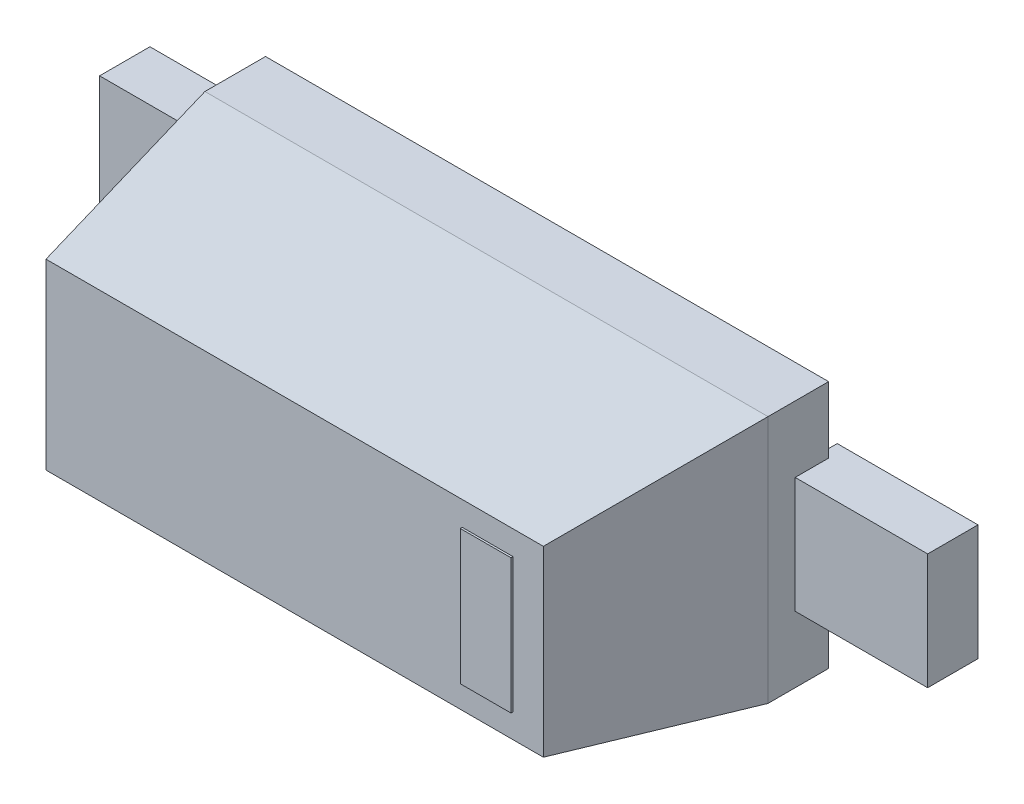
ISO-10303-21;
HEADER;
FILE_DESCRIPTION(('STEP AP214'),'2;1');
FILE_NAME('part.step','',(''),(''),'','','');
FILE_SCHEMA(('AUTOMOTIVE_DESIGN { 1 0 10303 214 1 1 1 1 }'));
ENDSEC;
DATA;
#1=APPLICATION_CONTEXT('core data for automotive mechanical design processes');
#2=APPLICATION_PROTOCOL_DEFINITION('international standard','automotive_design',2000,#1);
#3=PRODUCT_CONTEXT('',#1,'mechanical');
#4=PRODUCT('Part','Part','',(#3));
#5=PRODUCT_RELATED_PRODUCT_CATEGORY('part','',(#4));
#6=PRODUCT_DEFINITION_FORMATION('','',#4);
#7=PRODUCT_DEFINITION_CONTEXT('part definition',#1,'design');
#8=PRODUCT_DEFINITION('design','',#6,#7);
#9=PRODUCT_DEFINITION_SHAPE('','',#8);
#10=(LENGTH_UNIT() NAMED_UNIT(*) SI_UNIT(.MILLI.,.METRE.));
#11=(NAMED_UNIT(*) PLANE_ANGLE_UNIT() SI_UNIT($,.RADIAN.));
#12=(NAMED_UNIT(*) SI_UNIT($,.STERADIAN.) SOLID_ANGLE_UNIT());
#13=UNCERTAINTY_MEASURE_WITH_UNIT(LENGTH_MEASURE(1.E-05),#10,'distance_accuracy_value','');
#14=(GEOMETRIC_REPRESENTATION_CONTEXT(3) GLOBAL_UNCERTAINTY_ASSIGNED_CONTEXT((#13)) GLOBAL_UNIT_ASSIGNED_CONTEXT((#10,
#11,#12)) REPRESENTATION_CONTEXT('',''));
#15=CARTESIAN_POINT('',(0.,0.,0.));
#16=DIRECTION('',(0.,0.,1.));
#17=DIRECTION('',(1.,0.,0.));
#18=AXIS2_PLACEMENT_3D('',#15,#16,#17);
#19=CARTESIAN_POINT('',(0.506,-0.203,0.819));
#20=DIRECTION('',(0.,0.,1.));
#21=DIRECTION('',(1.,0.,0.));
#22=AXIS2_PLACEMENT_3D('',#19,#20,#21);
#23=PLANE('',#22);
#24=DIRECTION('',(1.,0.,0.));
#25=VECTOR('',#24,1.);
#26=CARTESIAN_POINT('',(0.506,-0.203,0.819));
#27=LINE('',#26,#25);
#28=CARTESIAN_POINT('',(0.506,-0.203,0.819));
#29=VERTEX_POINT('',#28);
#30=CARTESIAN_POINT('',(0.659,-0.203,0.819));
#31=VERTEX_POINT('',#30);
#32=EDGE_CURVE('P0_E86',#29,#31,#27,.T.);
#33=ORIENTED_EDGE('',*,*,#32,.T.);
#34=DIRECTION('',(0.,1.,0.));
#35=VECTOR('',#34,1.);
#36=CARTESIAN_POINT('',(0.659,-0.203,0.819));
#37=LINE('',#36,#35);
#38=CARTESIAN_POINT('',(0.659,0.203,0.819));
#39=VERTEX_POINT('',#38);
#40=EDGE_CURVE('P0_E84',#31,#39,#37,.T.);
#41=ORIENTED_EDGE('',*,*,#40,.T.);
#42=DIRECTION('',(-1.,0.,0.));
#43=VECTOR('',#42,1.);
#44=CARTESIAN_POINT('',(0.659,0.203,0.819));
#45=LINE('',#44,#43);
#46=CARTESIAN_POINT('',(0.506,0.203,0.819));
#47=VERTEX_POINT('',#46);
#48=EDGE_CURVE('P0_E75',#39,#47,#45,.T.);
#49=ORIENTED_EDGE('',*,*,#48,.T.);
#50=DIRECTION('',(0.,-1.,0.));
#51=VECTOR('',#50,1.);
#52=CARTESIAN_POINT('',(0.506,0.203,0.819));
#53=LINE('',#52,#51);
#54=EDGE_CURVE('P0_E11',#47,#29,#53,.T.);
#55=ORIENTED_EDGE('',*,*,#54,.T.);
#56=EDGE_LOOP('',(#33,#41,#49,#55));
#57=FACE_BOUND('',#56,.T.);
#58=ADVANCED_FACE('P0_F17',(#57),#23,.T.);
#59=CARTESIAN_POINT('',(0.506,0.203,0.813));
#60=DIRECTION('',(0.,0.,-1.));
#61=DIRECTION('',(0.,-1.,0.));
#62=AXIS2_PLACEMENT_3D('',#59,#60,#61);
#63=PLANE('',#62);
#64=DIRECTION('',(1.,0.,0.));
#65=VECTOR('',#64,1.);
#66=CARTESIAN_POINT('',(0.506,0.203,0.813));
#67=LINE('',#66,#65);
#68=CARTESIAN_POINT('',(0.506,0.203,0.813));
#69=VERTEX_POINT('',#68);
#70=CARTESIAN_POINT('',(0.659,0.203,0.813));
#71=VERTEX_POINT('',#70);
#72=EDGE_CURVE('P0_E69',#69,#71,#67,.T.);
#73=ORIENTED_EDGE('',*,*,#72,.T.);
#74=DIRECTION('',(0.,-1.,0.));
#75=VECTOR('',#74,1.);
#76=CARTESIAN_POINT('',(0.659,0.203,0.813));
#77=LINE('',#76,#75);
#78=CARTESIAN_POINT('',(0.659,-0.203,0.813));
#79=VERTEX_POINT('',#78);
#80=EDGE_CURVE('P0_E21',#71,#79,#77,.T.);
#81=ORIENTED_EDGE('',*,*,#80,.T.);
#82=DIRECTION('',(-1.,0.,0.));
#83=VECTOR('',#82,1.);
#84=CARTESIAN_POINT('',(0.659,-0.203,0.813));
#85=LINE('',#84,#83);
#86=CARTESIAN_POINT('',(0.506,-0.203,0.813));
#87=VERTEX_POINT('',#86);
#88=EDGE_CURVE('P0_E110',#79,#87,#85,.T.);
#89=ORIENTED_EDGE('',*,*,#88,.T.);
#90=DIRECTION('',(0.,1.,0.));
#91=VECTOR('',#90,1.);
#92=CARTESIAN_POINT('',(0.506,-0.203,0.813));
#93=LINE('',#92,#91);
#94=EDGE_CURVE('P0_E28',#87,#69,#93,.T.);
#95=ORIENTED_EDGE('',*,*,#94,.T.);
#96=EDGE_LOOP('',(#73,#81,#89,#95));
#97=FACE_BOUND('',#96,.T.);
#98=ADVANCED_FACE('P0_F122',(#97),#63,.T.);
#99=CARTESIAN_POINT('',(0.506,0.203,0.813));
#100=DIRECTION('',(-1.,0.,0.));
#101=DIRECTION('',(0.,0.,1.));
#102=AXIS2_PLACEMENT_3D('',#99,#100,#101);
#103=PLANE('',#102);
#104=ORIENTED_EDGE('',*,*,#94,.F.);
#105=DIRECTION('',(0.,0.,1.));
#106=VECTOR('',#105,1.);
#107=CARTESIAN_POINT('',(0.506,-0.203,0.813));
#108=LINE('',#107,#106);
#109=EDGE_CURVE('P0_E99',#87,#29,#108,.T.);
#110=ORIENTED_EDGE('',*,*,#109,.T.);
#111=ORIENTED_EDGE('',*,*,#54,.F.);
#112=DIRECTION('',(0.,0.,-1.));
#113=VECTOR('',#112,1.);
#114=CARTESIAN_POINT('',(0.506,0.203,0.819));
#115=LINE('',#114,#113);
#116=EDGE_CURVE('P0_E81',#47,#69,#115,.T.);
#117=ORIENTED_EDGE('',*,*,#116,.T.);
#118=EDGE_LOOP('',(#104,#110,#111,#117));
#119=FACE_BOUND('',#118,.T.);
#120=ADVANCED_FACE('P0_F19',(#119),#103,.T.);
#121=CARTESIAN_POINT('',(0.659,0.203,0.813));
#122=DIRECTION('',(0.,1.,0.));
#123=DIRECTION('',(1.,0.,0.));
#124=AXIS2_PLACEMENT_3D('',#121,#122,#123);
#125=PLANE('',#124);
#126=ORIENTED_EDGE('',*,*,#72,.F.);
#127=ORIENTED_EDGE('',*,*,#116,.F.);
#128=ORIENTED_EDGE('',*,*,#48,.F.);
#129=DIRECTION('',(0.,0.,-1.));
#130=VECTOR('',#129,1.);
#131=CARTESIAN_POINT('',(0.659,0.203,0.819));
#132=LINE('',#131,#130);
#133=EDGE_CURVE('P0_E79',#39,#71,#132,.T.);
#134=ORIENTED_EDGE('',*,*,#133,.T.);
#135=EDGE_LOOP('',(#126,#127,#128,#134));
#136=FACE_BOUND('',#135,.T.);
#137=ADVANCED_FACE('P0_F77',(#136),#125,.T.);
#138=CARTESIAN_POINT('',(0.659,-0.203,0.813));
#139=DIRECTION('',(1.,0.,0.));
#140=DIRECTION('',(0.,1.,0.));
#141=AXIS2_PLACEMENT_3D('',#138,#139,#140);
#142=PLANE('',#141);
#143=ORIENTED_EDGE('',*,*,#80,.F.);
#144=ORIENTED_EDGE('',*,*,#133,.F.);
#145=ORIENTED_EDGE('',*,*,#40,.F.);
#146=DIRECTION('',(0.,0.,-1.));
#147=VECTOR('',#146,1.);
#148=CARTESIAN_POINT('',(0.659,-0.203,0.819));
#149=LINE('',#148,#147);
#150=EDGE_CURVE('P0_E106',#31,#79,#149,.T.);
#151=ORIENTED_EDGE('',*,*,#150,.T.);
#152=EDGE_LOOP('',(#143,#144,#145,#151));
#153=FACE_BOUND('',#152,.T.);
#154=ADVANCED_FACE('P0_F92',(#153),#142,.T.);
#155=CARTESIAN_POINT('',(0.506,-0.203,0.813));
#156=DIRECTION('',(0.,-1.,0.));
#157=DIRECTION('',(0.,0.,-1.));
#158=AXIS2_PLACEMENT_3D('',#155,#156,#157);
#159=PLANE('',#158);
#160=ORIENTED_EDGE('',*,*,#88,.F.);
#161=ORIENTED_EDGE('',*,*,#150,.F.);
#162=ORIENTED_EDGE('',*,*,#32,.F.);
#163=ORIENTED_EDGE('',*,*,#109,.F.);
#164=EDGE_LOOP('',(#160,#161,#162,#163));
#165=FACE_BOUND('',#164,.T.);
#166=ADVANCED_FACE('P0_F121',(#165),#159,.T.);
#167=CLOSED_SHELL('',(#58,#98,#120,#137,#154,#166));
#168=MANIFOLD_SOLID_BREP('P0_B1',#167);
#169=CARTESIAN_POINT('',(-0.85,0.375,0.051));
#170=DIRECTION('',(-1.,0.,0.));
#171=DIRECTION('',(0.,0.,1.));
#172=AXIS2_PLACEMENT_3D('',#169,#170,#171);
#173=PLANE('',#172);
#174=DIRECTION('',(0.,-1.,0.));
#175=VECTOR('',#174,1.);
#176=CARTESIAN_POINT('',(-0.85,0.375,0.051));
#177=LINE('',#176,#175);
#178=CARTESIAN_POINT('',(-0.85,0.375,0.051));
#179=VERTEX_POINT('',#178);
#180=CARTESIAN_POINT('',(-0.85,-0.375,0.051));
#181=VERTEX_POINT('',#180);
#182=EDGE_CURVE('P1_E117',#179,#181,#177,.T.);
#183=ORIENTED_EDGE('',*,*,#182,.T.);
#184=DIRECTION('',(0.,0.,1.));
#185=VECTOR('',#184,1.);
#186=CARTESIAN_POINT('',(-0.85,-0.375,0.051));
#187=LINE('',#186,#185);
#188=CARTESIAN_POINT('',(-0.85,-0.375,0.234));
#189=VERTEX_POINT('',#188);
#190=EDGE_CURVE('P1_E91',#181,#189,#187,.T.);
#191=ORIENTED_EDGE('',*,*,#190,.T.);
#192=DIRECTION('',(0.,1.,0.));
#193=VECTOR('',#192,1.);
#194=CARTESIAN_POINT('',(-0.85,-0.375,0.234));
#195=LINE('',#194,#193);
#196=CARTESIAN_POINT('',(-0.85,0.375,0.234));
#197=VERTEX_POINT('',#196);
#198=EDGE_CURVE('P1_E92',#189,#197,#195,.T.);
#199=ORIENTED_EDGE('',*,*,#198,.T.);
#200=DIRECTION('',(0.,0.,-1.));
#201=VECTOR('',#200,1.);
#202=CARTESIAN_POINT('',(-0.85,0.375,0.234));
#203=LINE('',#202,#201);
#204=EDGE_CURVE('P1_E11',#197,#179,#203,.T.);
#205=ORIENTED_EDGE('',*,*,#204,.T.);
#206=EDGE_LOOP('',(#183,#191,#199,#205));
#207=FACE_BOUND('',#206,.T.);
#208=ADVANCED_FACE('P1_F17',(#207),#173,.T.);
#209=CARTESIAN_POINT('',(0.85,0.375,0.051));
#210=DIRECTION('',(0.,1.,0.));
#211=DIRECTION('',(1.,0.,0.));
#212=AXIS2_PLACEMENT_3D('',#209,#210,#211);
#213=PLANE('',#212);
#214=DIRECTION('',(-1.,0.,0.));
#215=VECTOR('',#214,1.);
#216=CARTESIAN_POINT('',(0.85,0.375,0.051));
#217=LINE('',#216,#215);
#218=CARTESIAN_POINT('',(0.85,0.375,0.051));
#219=VERTEX_POINT('',#218);
#220=EDGE_CURVE('P1_E158',#219,#179,#217,.T.);
#221=ORIENTED_EDGE('',*,*,#220,.T.);
#222=ORIENTED_EDGE('',*,*,#204,.F.);
#223=DIRECTION('',(1.,0.,0.));
#224=VECTOR('',#223,1.);
#225=CARTESIAN_POINT('',(-0.85,0.375,0.234));
#226=LINE('',#225,#224);
#227=CARTESIAN_POINT('',(0.85,0.375,0.234));
#228=VERTEX_POINT('',#227);
#229=EDGE_CURVE('P1_E129',#197,#228,#226,.T.);
#230=ORIENTED_EDGE('',*,*,#229,.T.);
#231=DIRECTION('',(0.,0.,-1.));
#232=VECTOR('',#231,1.);
#233=CARTESIAN_POINT('',(0.85,0.375,0.234));
#234=LINE('',#233,#232);
#235=EDGE_CURVE('P1_E21',#228,#219,#234,.T.);
#236=ORIENTED_EDGE('',*,*,#235,.T.);
#237=EDGE_LOOP('',(#221,#222,#230,#236));
#238=FACE_BOUND('',#237,.T.);
#239=ADVANCED_FACE('P1_F222',(#238),#213,.T.);
#240=CARTESIAN_POINT('',(0.85,-0.375,0.051));
#241=DIRECTION('',(1.,0.,0.));
#242=DIRECTION('',(0.,1.,0.));
#243=AXIS2_PLACEMENT_3D('',#240,#241,#242);
#244=PLANE('',#243);
#245=DIRECTION('',(0.,1.,0.));
#246=VECTOR('',#245,1.);
#247=CARTESIAN_POINT('',(0.85,-0.375,0.051));
#248=LINE('',#247,#246);
#249=CARTESIAN_POINT('',(0.85,-0.375,0.051));
#250=VERTEX_POINT('',#249);
#251=EDGE_CURVE('P1_E147',#250,#219,#248,.T.);
#252=ORIENTED_EDGE('',*,*,#251,.T.);
#253=ORIENTED_EDGE('',*,*,#235,.F.);
#254=DIRECTION('',(0.,-1.,0.));
#255=VECTOR('',#254,1.);
#256=CARTESIAN_POINT('',(0.85,0.375,0.234));
#257=LINE('',#256,#255);
#258=CARTESIAN_POINT('',(0.85,-0.375,0.234));
#259=VERTEX_POINT('',#258);
#260=EDGE_CURVE('P1_E95',#228,#259,#257,.T.);
#261=ORIENTED_EDGE('',*,*,#260,.T.);
#262=DIRECTION('',(0.,0.,-1.));
#263=VECTOR('',#262,1.);
#264=CARTESIAN_POINT('',(0.85,-0.375,0.234));
#265=LINE('',#264,#263);
#266=EDGE_CURVE('P1_E80',#259,#250,#265,.T.);
#267=ORIENTED_EDGE('',*,*,#266,.T.);
#268=EDGE_LOOP('',(#252,#253,#261,#267));
#269=FACE_BOUND('',#268,.T.);
#270=ADVANCED_FACE('P1_F97',(#269),#244,.T.);
#271=CARTESIAN_POINT('',(-0.85,-0.375,0.051));
#272=DIRECTION('',(0.,-1.,0.));
#273=DIRECTION('',(0.,0.,-1.));
#274=AXIS2_PLACEMENT_3D('',#271,#272,#273);
#275=PLANE('',#274);
#276=DIRECTION('',(1.,0.,0.));
#277=VECTOR('',#276,1.);
#278=CARTESIAN_POINT('',(-0.85,-0.375,0.051));
#279=LINE('',#278,#277);
#280=EDGE_CURVE('P1_E86',#181,#250,#279,.T.);
#281=ORIENTED_EDGE('',*,*,#280,.T.);
#282=ORIENTED_EDGE('',*,*,#266,.F.);
#283=DIRECTION('',(-1.,0.,0.));
#284=VECTOR('',#283,1.);
#285=CARTESIAN_POINT('',(0.85,-0.375,0.234));
#286=LINE('',#285,#284);
#287=EDGE_CURVE('P1_E84',#259,#189,#286,.T.);
#288=ORIENTED_EDGE('',*,*,#287,.T.);
#289=ORIENTED_EDGE('',*,*,#190,.F.);
#290=EDGE_LOOP('',(#281,#282,#288,#289));
#291=FACE_BOUND('',#290,.T.);
#292=ADVANCED_FACE('P1_F82',(#291),#275,.T.);
#293=CARTESIAN_POINT('',(-0.85,0.375,0.234));
#294=DIRECTION('',(-0.985627010751292,0.,0.168936069794086));
#295=DIRECTION('',(0.,1.,0.));
#296=AXIS2_PLACEMENT_3D('',#293,#294,#295);
#297=PLANE('',#296);
#298=ORIENTED_EDGE('',*,*,#198,.F.);
#299=DIRECTION('',(0.166575805053801,0.166575805053801,0.971856472089041));
#300=VECTOR('',#299,1.);
#301=CARTESIAN_POINT('',(-0.839594687939004,-0.364594687939004,0.294707915338117));
#302=LINE('',#301,#300);
#303=CARTESIAN_POINT('',(-0.750759635192991,-0.275759635192991,0.81299999966089));
#304=VERTEX_POINT('',#303);
#305=EDGE_CURVE('P1_E103',#189,#304,#302,.T.);
#306=ORIENTED_EDGE('',*,*,#305,.T.);
#307=DIRECTION('',(0.,1.,0.));
#308=VECTOR('',#307,1.);
#309=CARTESIAN_POINT('',(-0.750759634888438,0.0495,0.813));
#310=LINE('',#309,#308);
#311=CARTESIAN_POINT('',(-0.750759635192991,0.275759635192991,0.812999999660889));
#312=VERTEX_POINT('',#311);
#313=EDGE_CURVE('P1_E157',#304,#312,#310,.T.);
#314=ORIENTED_EDGE('',*,*,#313,.T.);
#315=DIRECTION('',(-0.166575805053801,0.166575805053801,-0.971856472089041));
#316=VECTOR('',#315,1.);
#317=CARTESIAN_POINT('',(-0.826414625995077,0.351414625995076,0.371604608099732));
#318=LINE('',#317,#316);
#319=EDGE_CURVE('P1_E126',#312,#197,#318,.T.);
#320=ORIENTED_EDGE('',*,*,#319,.T.);
#321=EDGE_LOOP('',(#298,#306,#314,#320));
#322=FACE_BOUND('',#321,.T.);
#323=ADVANCED_FACE('P1_F172',(#322),#297,.T.);
#324=CARTESIAN_POINT('',(0.85,0.375,0.234));
#325=DIRECTION('',(0.,0.985627010751292,0.168936069794086));
#326=DIRECTION('',(1.,0.,0.));
#327=AXIS2_PLACEMENT_3D('',#324,#325,#326);
#328=PLANE('',#327);
#329=ORIENTED_EDGE('',*,*,#229,.F.);
#330=ORIENTED_EDGE('',*,*,#319,.F.);
#331=DIRECTION('',(1.,0.,0.));
#332=VECTOR('',#331,1.);
#333=CARTESIAN_POINT('',(0.0495,0.275759634888438,0.813));
#334=LINE('',#333,#332);
#335=CARTESIAN_POINT('',(0.750759635192991,0.275759635192991,0.812999999660889));
#336=VERTEX_POINT('',#335);
#337=EDGE_CURVE('P1_E153',#312,#336,#334,.T.);
#338=ORIENTED_EDGE('',*,*,#337,.T.);
#339=DIRECTION('',(0.166575805053801,0.166575805053801,-0.971856472089041));
#340=VECTOR('',#339,1.);
#341=CARTESIAN_POINT('',(0.839594687939004,0.364594687939004,0.294707915338117));
#342=LINE('',#341,#340);
#343=EDGE_CURVE('P1_E102',#336,#228,#342,.T.);
#344=ORIENTED_EDGE('',*,*,#343,.T.);
#345=EDGE_LOOP('',(#329,#330,#338,#344));
#346=FACE_BOUND('',#345,.T.);
#347=ADVANCED_FACE('P1_F176',(#346),#328,.T.);
#348=CARTESIAN_POINT('',(0.85,-0.375,0.234));
#349=DIRECTION('',(0.985627010751292,0.,0.168936069794086));
#350=DIRECTION('',(0.,-1.,0.));
#351=AXIS2_PLACEMENT_3D('',#348,#349,#350);
#352=PLANE('',#351);
#353=ORIENTED_EDGE('',*,*,#260,.F.);
#354=ORIENTED_EDGE('',*,*,#343,.F.);
#355=DIRECTION('',(0.,-1.,0.));
#356=VECTOR('',#355,1.);
#357=CARTESIAN_POINT('',(0.750759634888438,-0.3255,0.813));
#358=LINE('',#357,#356);
#359=CARTESIAN_POINT('',(0.750759635192991,-0.275759635192991,0.812999999660889));
#360=VERTEX_POINT('',#359);
#361=EDGE_CURVE('P1_E109',#336,#360,#358,.T.);
#362=ORIENTED_EDGE('',*,*,#361,.T.);
#363=DIRECTION('',(0.166575805053801,-0.166575805053801,-0.971856472089041));
#364=VECTOR('',#363,1.);
#365=CARTESIAN_POINT('',(0.826414625995077,-0.351414625995076,0.371604608099732));
#366=LINE('',#365,#364);
#367=EDGE_CURVE('P1_E106',#360,#259,#366,.T.);
#368=ORIENTED_EDGE('',*,*,#367,.T.);
#369=EDGE_LOOP('',(#353,#354,#362,#368));
#370=FACE_BOUND('',#369,.T.);
#371=ADVANCED_FACE('P1_F107',(#370),#352,.T.);
#372=CARTESIAN_POINT('',(-0.85,-0.375,0.234));
#373=DIRECTION('',(0.,-0.985627010751292,0.168936069794086));
#374=DIRECTION('',(-1.,0.,0.));
#375=AXIS2_PLACEMENT_3D('',#372,#373,#374);
#376=PLANE('',#375);
#377=ORIENTED_EDGE('',*,*,#287,.F.);
#378=ORIENTED_EDGE('',*,*,#367,.F.);
#379=DIRECTION('',(-1.,0.,0.));
#380=VECTOR('',#379,1.);
#381=CARTESIAN_POINT('',(-0.8005,-0.275759634888438,0.813));
#382=LINE('',#381,#380);
#383=EDGE_CURVE('P1_E148',#360,#304,#382,.T.);
#384=ORIENTED_EDGE('',*,*,#383,.T.);
#385=ORIENTED_EDGE('',*,*,#305,.F.);
#386=EDGE_LOOP('',(#377,#378,#384,#385));
#387=FACE_BOUND('',#386,.T.);
#388=ADVANCED_FACE('P1_F19',(#387),#376,.T.);
#389=CARTESIAN_POINT('',(-0.85,0.375,0.051));
#390=DIRECTION('',(0.,0.,-1.));
#391=DIRECTION('',(0.,-1.,0.));
#392=AXIS2_PLACEMENT_3D('',#389,#390,#391);
#393=PLANE('',#392);
#394=ORIENTED_EDGE('',*,*,#220,.F.);
#395=ORIENTED_EDGE('',*,*,#251,.F.);
#396=ORIENTED_EDGE('',*,*,#280,.F.);
#397=ORIENTED_EDGE('',*,*,#182,.F.);
#398=EDGE_LOOP('',(#394,#395,#396,#397));
#399=FACE_BOUND('',#398,.T.);
#400=ADVANCED_FACE('P1_F185',(#399),#393,.T.);
#401=CARTESIAN_POINT('',(-0.751,-0.276,0.813));
#402=DIRECTION('',(0.,0.,1.));
#403=DIRECTION('',(1.,0.,0.));
#404=AXIS2_PLACEMENT_3D('',#401,#402,#403);
#405=PLANE('',#404);
#406=ORIENTED_EDGE('',*,*,#383,.F.);
#407=ORIENTED_EDGE('',*,*,#361,.F.);
#408=ORIENTED_EDGE('',*,*,#337,.F.);
#409=ORIENTED_EDGE('',*,*,#313,.F.);
#410=EDGE_LOOP('',(#406,#407,#408,#409));
#411=FACE_BOUND('',#410,.T.);
#412=ADVANCED_FACE('P1_F174',(#411),#405,.T.);
#413=CLOSED_SHELL('',(#208,#239,#270,#292,#323,#347,#371,#388,#400,#412));
#414=MANIFOLD_SOLID_BREP('P1_B1',#413);
#415=CARTESIAN_POINT('',(-1.25,0.175,0.));
#416=DIRECTION('',(0.,0.,-1.));
#417=DIRECTION('',(0.,-1.,0.));
#418=AXIS2_PLACEMENT_3D('',#415,#416,#417);
#419=PLANE('',#418);
#420=DIRECTION('',(1.,0.,0.));
#421=VECTOR('',#420,1.);
#422=CARTESIAN_POINT('',(-1.25,0.175,0.));
#423=LINE('',#422,#421);
#424=CARTESIAN_POINT('',(-1.25,0.175,0.));
#425=VERTEX_POINT('',#424);
#426=CARTESIAN_POINT('',(-0.825,0.175,0.));
#427=VERTEX_POINT('',#426);
#428=EDGE_CURVE('P2_E113',#425,#427,#423,.T.);
#429=ORIENTED_EDGE('',*,*,#428,.T.);
#430=DIRECTION('',(0.,-1.,0.));
#431=VECTOR('',#430,1.);
#432=CARTESIAN_POINT('',(-0.825,0.175,0.));
#433=LINE('',#432,#431);
#434=CARTESIAN_POINT('',(-0.825,-0.175,0.));
#435=VERTEX_POINT('',#434);
#436=EDGE_CURVE('P2_E11',#427,#435,#433,.T.);
#437=ORIENTED_EDGE('',*,*,#436,.T.);
#438=DIRECTION('',(-1.,0.,0.));
#439=VECTOR('',#438,1.);
#440=CARTESIAN_POINT('',(-0.825,-0.175,0.));
#441=LINE('',#440,#439);
#442=CARTESIAN_POINT('',(-1.25,-0.175,0.));
#443=VERTEX_POINT('',#442);
#444=EDGE_CURVE('P2_E158',#435,#443,#441,.T.);
#445=ORIENTED_EDGE('',*,*,#444,.T.);
#446=DIRECTION('',(0.,1.,0.));
#447=VECTOR('',#446,1.);
#448=CARTESIAN_POINT('',(-1.25,-0.175,0.));
#449=LINE('',#448,#447);
#450=EDGE_CURVE('P2_E26',#443,#425,#449,.T.);
#451=ORIENTED_EDGE('',*,*,#450,.T.);
#452=EDGE_LOOP('',(#429,#437,#445,#451));
#453=FACE_BOUND('',#452,.T.);
#454=ADVANCED_FACE('P2_F16',(#453),#419,.T.);
#455=CARTESIAN_POINT('',(-0.85,-0.175,0.051));
#456=DIRECTION('',(1.,0.,0.));
#457=DIRECTION('',(0.,1.,0.));
#458=AXIS2_PLACEMENT_3D('',#455,#456,#457);
#459=PLANE('',#458);
#460=DIRECTION('',(0.,1.,0.));
#461=VECTOR('',#460,1.);
#462=CARTESIAN_POINT('',(-0.85,-0.175,0.051));
#463=LINE('',#462,#461);
#464=CARTESIAN_POINT('',(-0.85,-0.175,0.051));
#465=VERTEX_POINT('',#464);
#466=CARTESIAN_POINT('',(-0.85,0.175,0.051));
#467=VERTEX_POINT('',#466);
#468=EDGE_CURVE('P2_E52',#465,#467,#463,.T.);
#469=ORIENTED_EDGE('',*,*,#468,.T.);
#470=DIRECTION('',(0.,0.,1.));
#471=VECTOR('',#470,1.);
#472=CARTESIAN_POINT('',(-0.85,0.175,0.051));
#473=LINE('',#472,#471);
#474=CARTESIAN_POINT('',(-0.85,0.175,0.152));
#475=VERTEX_POINT('',#474);
#476=EDGE_CURVE('P2_E108',#467,#475,#473,.T.);
#477=ORIENTED_EDGE('',*,*,#476,.T.);
#478=DIRECTION('',(0.,-1.,0.));
#479=VECTOR('',#478,1.);
#480=CARTESIAN_POINT('',(-0.85,0.175,0.152));
#481=LINE('',#480,#479);
#482=CARTESIAN_POINT('',(-0.85,-0.175,0.152));
#483=VERTEX_POINT('',#482);
#484=EDGE_CURVE('P2_E100',#475,#483,#481,.T.);
#485=ORIENTED_EDGE('',*,*,#484,.T.);
#486=DIRECTION('',(0.,0.,-1.));
#487=VECTOR('',#486,1.);
#488=CARTESIAN_POINT('',(-0.85,-0.175,0.152));
#489=LINE('',#488,#487);
#490=EDGE_CURVE('P2_E145',#483,#465,#489,.T.);
#491=ORIENTED_EDGE('',*,*,#490,.T.);
#492=EDGE_LOOP('',(#469,#477,#485,#491));
#493=FACE_BOUND('',#492,.T.);
#494=ADVANCED_FACE('P2_F138',(#493),#459,.T.);
#495=CARTESIAN_POINT('',(-0.825,-0.175,0.));
#496=DIRECTION('',(1.,0.,0.));
#497=DIRECTION('',(0.,1.,0.));
#498=AXIS2_PLACEMENT_3D('',#495,#496,#497);
#499=PLANE('',#498);
#500=ORIENTED_EDGE('',*,*,#436,.F.);
#501=DIRECTION('',(0.,0.,1.));
#502=VECTOR('',#501,1.);
#503=CARTESIAN_POINT('',(-0.825,0.175,0.));
#504=LINE('',#503,#502);
#505=CARTESIAN_POINT('',(-0.825,0.175,0.051));
#506=VERTEX_POINT('',#505);
#507=EDGE_CURVE('P2_E130',#427,#506,#504,.T.);
#508=ORIENTED_EDGE('',*,*,#507,.T.);
#509=DIRECTION('',(0.,-1.,0.));
#510=VECTOR('',#509,1.);
#511=CARTESIAN_POINT('',(-0.825,0.175,0.051));
#512=LINE('',#511,#510);
#513=CARTESIAN_POINT('',(-0.825,-0.175,0.051));
#514=VERTEX_POINT('',#513);
#515=EDGE_CURVE('P2_E39',#506,#514,#512,.T.);
#516=ORIENTED_EDGE('',*,*,#515,.T.);
#517=DIRECTION('',(0.,0.,-1.));
#518=VECTOR('',#517,1.);
#519=CARTESIAN_POINT('',(-0.825,-0.175,0.051));
#520=LINE('',#519,#518);
#521=EDGE_CURVE('P2_E152',#514,#435,#520,.T.);
#522=ORIENTED_EDGE('',*,*,#521,.T.);
#523=EDGE_LOOP('',(#500,#508,#516,#522));
#524=FACE_BOUND('',#523,.T.);
#525=ADVANCED_FACE('P2_F18',(#524),#499,.T.);
#526=CARTESIAN_POINT('',(-1.25,0.175,0.));
#527=DIRECTION('',(-1.,0.,0.));
#528=DIRECTION('',(0.,0.,1.));
#529=AXIS2_PLACEMENT_3D('',#526,#527,#528);
#530=PLANE('',#529);
#531=ORIENTED_EDGE('',*,*,#450,.F.);
#532=DIRECTION('',(0.,0.,1.));
#533=VECTOR('',#532,1.);
#534=CARTESIAN_POINT('',(-1.25,-0.175,0.));
#535=LINE('',#534,#533);
#536=CARTESIAN_POINT('',(-1.25,-0.175,0.152));
#537=VERTEX_POINT('',#536);
#538=EDGE_CURVE('P2_E95',#443,#537,#535,.T.);
#539=ORIENTED_EDGE('',*,*,#538,.T.);
#540=DIRECTION('',(0.,1.,0.));
#541=VECTOR('',#540,1.);
#542=CARTESIAN_POINT('',(-1.25,-0.175,0.152));
#543=LINE('',#542,#541);
#544=CARTESIAN_POINT('',(-1.25,0.175,0.152));
#545=VERTEX_POINT('',#544);
#546=EDGE_CURVE('P2_E89',#537,#545,#543,.T.);
#547=ORIENTED_EDGE('',*,*,#546,.T.);
#548=DIRECTION('',(0.,0.,-1.));
#549=VECTOR('',#548,1.);
#550=CARTESIAN_POINT('',(-1.25,0.175,0.152));
#551=LINE('',#550,#549);
#552=EDGE_CURVE('P2_E20',#545,#425,#551,.T.);
#553=ORIENTED_EDGE('',*,*,#552,.T.);
#554=EDGE_LOOP('',(#531,#539,#547,#553));
#555=FACE_BOUND('',#554,.T.);
#556=ADVANCED_FACE('P2_F91',(#555),#530,.T.);
#557=CARTESIAN_POINT('',(-0.85,-0.175,0.051));
#558=DIRECTION('',(0.,0.,1.));
#559=DIRECTION('',(1.,0.,0.));
#560=AXIS2_PLACEMENT_3D('',#557,#558,#559);
#561=PLANE('',#560);
#562=DIRECTION('',(1.,0.,0.));
#563=VECTOR('',#562,1.);
#564=CARTESIAN_POINT('',(-0.85,-0.175,0.051));
#565=LINE('',#564,#563);
#566=EDGE_CURVE('P2_E142',#465,#514,#565,.T.);
#567=ORIENTED_EDGE('',*,*,#566,.T.);
#568=ORIENTED_EDGE('',*,*,#515,.F.);
#569=DIRECTION('',(-1.,0.,0.));
#570=VECTOR('',#569,1.);
#571=CARTESIAN_POINT('',(-0.825,0.175,0.051));
#572=LINE('',#571,#570);
#573=EDGE_CURVE('P2_E133',#506,#467,#572,.T.);
#574=ORIENTED_EDGE('',*,*,#573,.T.);
#575=ORIENTED_EDGE('',*,*,#468,.F.);
#576=EDGE_LOOP('',(#567,#568,#574,#575));
#577=FACE_BOUND('',#576,.T.);
#578=ADVANCED_FACE('P2_F140',(#577),#561,.T.);
#579=CARTESIAN_POINT('',(-1.25,-0.175,0.152));
#580=DIRECTION('',(0.,0.,1.));
#581=DIRECTION('',(1.,0.,0.));
#582=AXIS2_PLACEMENT_3D('',#579,#580,#581);
#583=PLANE('',#582);
#584=DIRECTION('',(1.,0.,0.));
#585=VECTOR('',#584,1.);
#586=CARTESIAN_POINT('',(-1.25,-0.175,0.152));
#587=LINE('',#586,#585);
#588=EDGE_CURVE('P2_E124',#537,#483,#587,.T.);
#589=ORIENTED_EDGE('',*,*,#588,.T.);
#590=ORIENTED_EDGE('',*,*,#484,.F.);
#591=DIRECTION('',(-1.,0.,0.));
#592=VECTOR('',#591,1.);
#593=CARTESIAN_POINT('',(-0.85,0.175,0.152));
#594=LINE('',#593,#592);
#595=EDGE_CURVE('P2_E103',#475,#545,#594,.T.);
#596=ORIENTED_EDGE('',*,*,#595,.T.);
#597=ORIENTED_EDGE('',*,*,#546,.F.);
#598=EDGE_LOOP('',(#589,#590,#596,#597));
#599=FACE_BOUND('',#598,.T.);
#600=ADVANCED_FACE('P2_F104',(#599),#583,.T.);
#601=CARTESIAN_POINT('',(-0.825,0.175,0.));
#602=DIRECTION('',(0.,1.,0.));
#603=DIRECTION('',(1.,0.,0.));
#604=AXIS2_PLACEMENT_3D('',#601,#602,#603);
#605=PLANE('',#604);
#606=ORIENTED_EDGE('',*,*,#428,.F.);
#607=ORIENTED_EDGE('',*,*,#552,.F.);
#608=ORIENTED_EDGE('',*,*,#595,.F.);
#609=ORIENTED_EDGE('',*,*,#476,.F.);
#610=ORIENTED_EDGE('',*,*,#573,.F.);
#611=ORIENTED_EDGE('',*,*,#507,.F.);
#612=EDGE_LOOP('',(#606,#607,#608,#609,#610,#611));
#613=FACE_BOUND('',#612,.T.);
#614=ADVANCED_FACE('P2_F110',(#613),#605,.T.);
#615=CARTESIAN_POINT('',(-1.25,-0.175,0.));
#616=DIRECTION('',(0.,-1.,0.));
#617=DIRECTION('',(0.,0.,-1.));
#618=AXIS2_PLACEMENT_3D('',#615,#616,#617);
#619=PLANE('',#618);
#620=ORIENTED_EDGE('',*,*,#444,.F.);
#621=ORIENTED_EDGE('',*,*,#521,.F.);
#622=ORIENTED_EDGE('',*,*,#566,.F.);
#623=ORIENTED_EDGE('',*,*,#490,.F.);
#624=ORIENTED_EDGE('',*,*,#588,.F.);
#625=ORIENTED_EDGE('',*,*,#538,.F.);
#626=EDGE_LOOP('',(#620,#621,#622,#623,#624,#625));
#627=FACE_BOUND('',#626,.T.);
#628=ADVANCED_FACE('P2_F150',(#627),#619,.T.);
#629=CLOSED_SHELL('',(#454,#494,#525,#556,#578,#600,#614,#628));
#630=MANIFOLD_SOLID_BREP('P2_B1',#629);
#631=CARTESIAN_POINT('',(1.25,-0.175,0.));
#632=DIRECTION('',(0.,0.,-1.));
#633=DIRECTION('',(0.,-1.,0.));
#634=AXIS2_PLACEMENT_3D('',#631,#632,#633);
#635=PLANE('',#634);
#636=DIRECTION('',(-1.,0.,0.));
#637=VECTOR('',#636,1.);
#638=CARTESIAN_POINT('',(1.25,-0.175,0.));
#639=LINE('',#638,#637);
#640=CARTESIAN_POINT('',(1.25,-0.175,0.));
#641=VERTEX_POINT('',#640);
#642=CARTESIAN_POINT('',(0.825,-0.175,0.));
#643=VERTEX_POINT('',#642);
#644=EDGE_CURVE('P3_E20',#641,#643,#639,.T.);
#645=ORIENTED_EDGE('',*,*,#644,.T.);
#646=DIRECTION('',(0.,1.,0.));
#647=VECTOR('',#646,1.);
#648=CARTESIAN_POINT('',(0.825,-0.175,0.));
#649=LINE('',#648,#647);
#650=CARTESIAN_POINT('',(0.825,0.175,0.));
#651=VERTEX_POINT('',#650);
#652=EDGE_CURVE('P3_E11',#643,#651,#649,.T.);
#653=ORIENTED_EDGE('',*,*,#652,.T.);
#654=DIRECTION('',(1.,0.,0.));
#655=VECTOR('',#654,1.);
#656=CARTESIAN_POINT('',(0.825,0.175,0.));
#657=LINE('',#656,#655);
#658=CARTESIAN_POINT('',(1.25,0.175,0.));
#659=VERTEX_POINT('',#658);
#660=EDGE_CURVE('P3_E134',#651,#659,#657,.T.);
#661=ORIENTED_EDGE('',*,*,#660,.T.);
#662=DIRECTION('',(0.,-1.,0.));
#663=VECTOR('',#662,1.);
#664=CARTESIAN_POINT('',(1.25,0.175,0.));
#665=LINE('',#664,#663);
#666=EDGE_CURVE('P3_E26',#659,#641,#665,.T.);
#667=ORIENTED_EDGE('',*,*,#666,.T.);
#668=EDGE_LOOP('',(#645,#653,#661,#667));
#669=FACE_BOUND('',#668,.T.);
#670=ADVANCED_FACE('P3_F16',(#669),#635,.T.);
#671=CARTESIAN_POINT('',(0.85,0.175,0.051));
#672=DIRECTION('',(-1.,0.,0.));
#673=DIRECTION('',(0.,0.,1.));
#674=AXIS2_PLACEMENT_3D('',#671,#672,#673);
#675=PLANE('',#674);
#676=DIRECTION('',(0.,-1.,0.));
#677=VECTOR('',#676,1.);
#678=CARTESIAN_POINT('',(0.85,0.175,0.051));
#679=LINE('',#678,#677);
#680=CARTESIAN_POINT('',(0.85,0.175,0.051));
#681=VERTEX_POINT('',#680);
#682=CARTESIAN_POINT('',(0.85,-0.175,0.051));
#683=VERTEX_POINT('',#682);
#684=EDGE_CURVE('P3_E52',#681,#683,#679,.T.);
#685=ORIENTED_EDGE('',*,*,#684,.T.);
#686=DIRECTION('',(0.,0.,1.));
#687=VECTOR('',#686,1.);
#688=CARTESIAN_POINT('',(0.85,-0.175,0.051));
#689=LINE('',#688,#687);
#690=CARTESIAN_POINT('',(0.85,-0.175,0.152));
#691=VERTEX_POINT('',#690);
#692=EDGE_CURVE('P3_E113',#683,#691,#689,.T.);
#693=ORIENTED_EDGE('',*,*,#692,.T.);
#694=DIRECTION('',(0.,1.,0.));
#695=VECTOR('',#694,1.);
#696=CARTESIAN_POINT('',(0.85,-0.175,0.152));
#697=LINE('',#696,#695);
#698=CARTESIAN_POINT('',(0.85,0.175,0.152));
#699=VERTEX_POINT('',#698);
#700=EDGE_CURVE('P3_E107',#691,#699,#697,.T.);
#701=ORIENTED_EDGE('',*,*,#700,.T.);
#702=DIRECTION('',(0.,0.,-1.));
#703=VECTOR('',#702,1.);
#704=CARTESIAN_POINT('',(0.85,0.175,0.152));
#705=LINE('',#704,#703);
#706=EDGE_CURVE('P3_E141',#699,#681,#705,.T.);
#707=ORIENTED_EDGE('',*,*,#706,.T.);
#708=EDGE_LOOP('',(#685,#693,#701,#707));
#709=FACE_BOUND('',#708,.T.);
#710=ADVANCED_FACE('P3_F161',(#709),#675,.T.);
#711=CARTESIAN_POINT('',(0.825,0.175,0.));
#712=DIRECTION('',(-1.,0.,0.));
#713=DIRECTION('',(0.,0.,1.));
#714=AXIS2_PLACEMENT_3D('',#711,#712,#713);
#715=PLANE('',#714);
#716=ORIENTED_EDGE('',*,*,#652,.F.);
#717=DIRECTION('',(0.,0.,1.));
#718=VECTOR('',#717,1.);
#719=CARTESIAN_POINT('',(0.825,-0.175,0.));
#720=LINE('',#719,#718);
#721=CARTESIAN_POINT('',(0.825,-0.175,0.051));
#722=VERTEX_POINT('',#721);
#723=EDGE_CURVE('P3_E145',#643,#722,#720,.T.);
#724=ORIENTED_EDGE('',*,*,#723,.T.);
#725=DIRECTION('',(0.,1.,0.));
#726=VECTOR('',#725,1.);
#727=CARTESIAN_POINT('',(0.825,-0.175,0.051));
#728=LINE('',#727,#726);
#729=CARTESIAN_POINT('',(0.825,0.175,0.051));
#730=VERTEX_POINT('',#729);
#731=EDGE_CURVE('P3_E39',#722,#730,#728,.T.);
#732=ORIENTED_EDGE('',*,*,#731,.T.);
#733=DIRECTION('',(0.,0.,-1.));
#734=VECTOR('',#733,1.);
#735=CARTESIAN_POINT('',(0.825,0.175,0.051));
#736=LINE('',#735,#734);
#737=EDGE_CURVE('P3_E129',#730,#651,#736,.T.);
#738=ORIENTED_EDGE('',*,*,#737,.T.);
#739=EDGE_LOOP('',(#716,#724,#732,#738));
#740=FACE_BOUND('',#739,.T.);
#741=ADVANCED_FACE('P3_F172',(#740),#715,.T.);
#742=CARTESIAN_POINT('',(1.25,-0.175,0.));
#743=DIRECTION('',(1.,0.,0.));
#744=DIRECTION('',(0.,1.,0.));
#745=AXIS2_PLACEMENT_3D('',#742,#743,#744);
#746=PLANE('',#745);
#747=ORIENTED_EDGE('',*,*,#666,.F.);
#748=DIRECTION('',(0.,0.,1.));
#749=VECTOR('',#748,1.);
#750=CARTESIAN_POINT('',(1.25,0.175,0.));
#751=LINE('',#750,#749);
#752=CARTESIAN_POINT('',(1.25,0.175,0.152));
#753=VERTEX_POINT('',#752);
#754=EDGE_CURVE('P3_E104',#659,#753,#751,.T.);
#755=ORIENTED_EDGE('',*,*,#754,.T.);
#756=DIRECTION('',(0.,-1.,0.));
#757=VECTOR('',#756,1.);
#758=CARTESIAN_POINT('',(1.25,0.175,0.152));
#759=LINE('',#758,#757);
#760=CARTESIAN_POINT('',(1.25,-0.175,0.152));
#761=VERTEX_POINT('',#760);
#762=EDGE_CURVE('P3_E79',#753,#761,#759,.T.);
#763=ORIENTED_EDGE('',*,*,#762,.T.);
#764=DIRECTION('',(0.,0.,-1.));
#765=VECTOR('',#764,1.);
#766=CARTESIAN_POINT('',(1.25,-0.175,0.152));
#767=LINE('',#766,#765);
#768=EDGE_CURVE('P3_E101',#761,#641,#767,.T.);
#769=ORIENTED_EDGE('',*,*,#768,.T.);
#770=EDGE_LOOP('',(#747,#755,#763,#769));
#771=FACE_BOUND('',#770,.T.);
#772=ADVANCED_FACE('P3_F99',(#771),#746,.T.);
#773=CARTESIAN_POINT('',(0.85,0.175,0.051));
#774=DIRECTION('',(0.,0.,1.));
#775=DIRECTION('',(1.,0.,0.));
#776=AXIS2_PLACEMENT_3D('',#773,#774,#775);
#777=PLANE('',#776);
#778=DIRECTION('',(-1.,0.,0.));
#779=VECTOR('',#778,1.);
#780=CARTESIAN_POINT('',(0.85,0.175,0.051));
#781=LINE('',#780,#779);
#782=EDGE_CURVE('P3_E133',#681,#730,#781,.T.);
#783=ORIENTED_EDGE('',*,*,#782,.T.);
#784=ORIENTED_EDGE('',*,*,#731,.F.);
#785=DIRECTION('',(1.,0.,0.));
#786=VECTOR('',#785,1.);
#787=CARTESIAN_POINT('',(0.825,-0.175,0.051));
#788=LINE('',#787,#786);
#789=EDGE_CURVE('P3_E128',#722,#683,#788,.T.);
#790=ORIENTED_EDGE('',*,*,#789,.T.);
#791=ORIENTED_EDGE('',*,*,#684,.F.);
#792=EDGE_LOOP('',(#783,#784,#790,#791));
#793=FACE_BOUND('',#792,.T.);
#794=ADVANCED_FACE('P3_F170',(#793),#777,.T.);
#795=CARTESIAN_POINT('',(1.25,0.175,0.152));
#796=DIRECTION('',(0.,0.,1.));
#797=DIRECTION('',(1.,0.,0.));
#798=AXIS2_PLACEMENT_3D('',#795,#796,#797);
#799=PLANE('',#798);
#800=DIRECTION('',(-1.,0.,0.));
#801=VECTOR('',#800,1.);
#802=CARTESIAN_POINT('',(1.25,0.175,0.152));
#803=LINE('',#802,#801);
#804=EDGE_CURVE('P3_E144',#753,#699,#803,.T.);
#805=ORIENTED_EDGE('',*,*,#804,.T.);
#806=ORIENTED_EDGE('',*,*,#700,.F.);
#807=DIRECTION('',(1.,0.,0.));
#808=VECTOR('',#807,1.);
#809=CARTESIAN_POINT('',(0.85,-0.175,0.152));
#810=LINE('',#809,#808);
#811=EDGE_CURVE('P3_E109',#691,#761,#810,.T.);
#812=ORIENTED_EDGE('',*,*,#811,.T.);
#813=ORIENTED_EDGE('',*,*,#762,.F.);
#814=EDGE_LOOP('',(#805,#806,#812,#813));
#815=FACE_BOUND('',#814,.T.);
#816=ADVANCED_FACE('P3_F18',(#815),#799,.T.);
#817=CARTESIAN_POINT('',(0.825,-0.175,0.));
#818=DIRECTION('',(0.,-1.,0.));
#819=DIRECTION('',(0.,0.,-1.));
#820=AXIS2_PLACEMENT_3D('',#817,#818,#819);
#821=PLANE('',#820);
#822=ORIENTED_EDGE('',*,*,#644,.F.);
#823=ORIENTED_EDGE('',*,*,#768,.F.);
#824=ORIENTED_EDGE('',*,*,#811,.F.);
#825=ORIENTED_EDGE('',*,*,#692,.F.);
#826=ORIENTED_EDGE('',*,*,#789,.F.);
#827=ORIENTED_EDGE('',*,*,#723,.F.);
#828=EDGE_LOOP('',(#822,#823,#824,#825,#826,#827));
#829=FACE_BOUND('',#828,.T.);
#830=ADVANCED_FACE('P3_F115',(#829),#821,.T.);
#831=CARTESIAN_POINT('',(1.25,0.175,0.));
#832=DIRECTION('',(0.,1.,0.));
#833=DIRECTION('',(1.,0.,0.));
#834=AXIS2_PLACEMENT_3D('',#831,#832,#833);
#835=PLANE('',#834);
#836=ORIENTED_EDGE('',*,*,#660,.F.);
#837=ORIENTED_EDGE('',*,*,#737,.F.);
#838=ORIENTED_EDGE('',*,*,#782,.F.);
#839=ORIENTED_EDGE('',*,*,#706,.F.);
#840=ORIENTED_EDGE('',*,*,#804,.F.);
#841=ORIENTED_EDGE('',*,*,#754,.F.);
#842=EDGE_LOOP('',(#836,#837,#838,#839,#840,#841));
#843=FACE_BOUND('',#842,.T.);
#844=ADVANCED_FACE('P3_F159',(#843),#835,.T.);
#845=CLOSED_SHELL('',(#670,#710,#741,#772,#794,#816,#830,#844));
#846=MANIFOLD_SOLID_BREP('P3_B1',#845);
#847=ADVANCED_BREP_SHAPE_REPRESENTATION('',(#18,#168,#414,#630,#846),#14);
#848=SHAPE_DEFINITION_REPRESENTATION(#9,#847);
ENDSEC;
END-ISO-10303-21;
